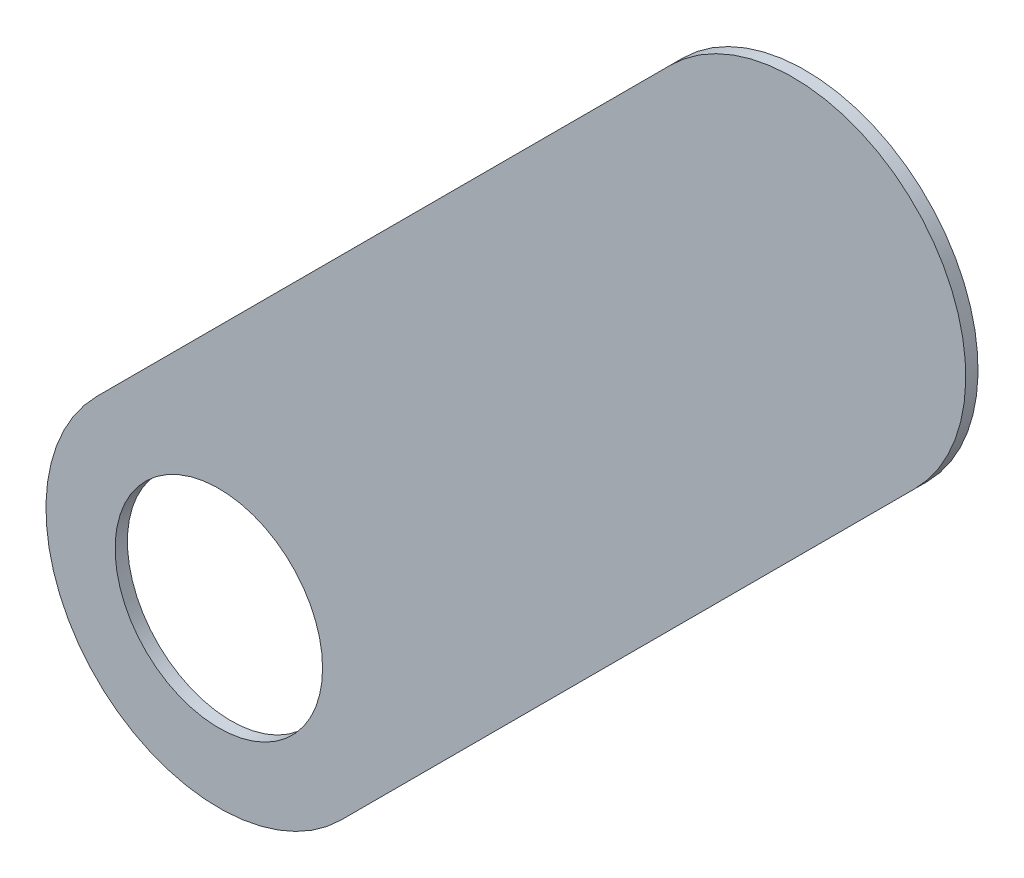
ISO-10303-21;
HEADER;
FILE_DESCRIPTION(('STEP AP214'),'2;1');
FILE_NAME('part.step','',(''),(''),'','','');
FILE_SCHEMA(('AUTOMOTIVE_DESIGN { 1 0 10303 214 1 1 1 1 }'));
ENDSEC;
DATA;
#1=APPLICATION_CONTEXT('core data for automotive mechanical design processes');
#2=APPLICATION_PROTOCOL_DEFINITION('international standard','automotive_design',2000,#1);
#3=PRODUCT_CONTEXT('',#1,'mechanical');
#4=PRODUCT('Part','Part','',(#3));
#5=PRODUCT_RELATED_PRODUCT_CATEGORY('part','',(#4));
#6=PRODUCT_DEFINITION_FORMATION('','',#4);
#7=PRODUCT_DEFINITION_CONTEXT('part definition',#1,'design');
#8=PRODUCT_DEFINITION('design','',#6,#7);
#9=PRODUCT_DEFINITION_SHAPE('','',#8);
#10=(LENGTH_UNIT() NAMED_UNIT(*) SI_UNIT(.MILLI.,.METRE.));
#11=(NAMED_UNIT(*) PLANE_ANGLE_UNIT() SI_UNIT($,.RADIAN.));
#12=(NAMED_UNIT(*) SI_UNIT($,.STERADIAN.) SOLID_ANGLE_UNIT());
#13=UNCERTAINTY_MEASURE_WITH_UNIT(LENGTH_MEASURE(1.E-05),#10,'distance_accuracy_value','');
#14=(GEOMETRIC_REPRESENTATION_CONTEXT(3) GLOBAL_UNCERTAINTY_ASSIGNED_CONTEXT((#13)) GLOBAL_UNIT_ASSIGNED_CONTEXT((#10,
#11,#12)) REPRESENTATION_CONTEXT('',''));
#15=CARTESIAN_POINT('',(0.,0.,0.));
#16=DIRECTION('',(0.,0.,1.));
#17=DIRECTION('',(1.,0.,0.));
#18=AXIS2_PLACEMENT_3D('',#15,#16,#17);
#19=CARTESIAN_POINT('',(57.79356996,78.14646804,0.));
#20=DIRECTION('',(-0.707106781186541,0.707106781186554,0.));
#21=DIRECTION('',(0.707106781186554,0.707106781186541,0.));
#22=AXIS2_PLACEMENT_3D('',#19,#20,#21);
#23=PLANE('',#22);
#24=DIRECTION('',(0.707106781186554,0.707106781186541,0.));
#25=VECTOR('',#24,1.);
#26=CARTESIAN_POINT('',(57.79356996,78.14646804,0.03556));
#27=LINE('',#26,#25);
#28=CARTESIAN_POINT('',(57.79356996,78.14646804,0.03556));
#29=VERTEX_POINT('',#28);
#30=CARTESIAN_POINT('',(59.45356156,79.80645964,0.03556));
#31=VERTEX_POINT('',#30);
#32=EDGE_CURVE('E11',#29,#31,#27,.T.);
#33=ORIENTED_EDGE('',*,*,#32,.F.);
#34=DIRECTION('',(0.,0.,1.));
#35=VECTOR('',#34,1.);
#36=CARTESIAN_POINT('',(57.79356996,78.14646804,0.));
#37=LINE('',#36,#35);
#38=CARTESIAN_POINT('',(57.79356996,78.14646804,0.));
#39=VERTEX_POINT('',#38);
#40=EDGE_CURVE('E24',#39,#29,#37,.T.);
#41=ORIENTED_EDGE('',*,*,#40,.F.);
#42=DIRECTION('',(0.707106781186554,0.707106781186541,0.));
#43=VECTOR('',#42,1.);
#44=CARTESIAN_POINT('',(57.79356996,78.14646804,0.));
#45=LINE('',#44,#43);
#46=CARTESIAN_POINT('',(59.45356156,79.80645964,0.));
#47=VERTEX_POINT('',#46);
#48=EDGE_CURVE('E96',#39,#47,#45,.T.);
#49=ORIENTED_EDGE('',*,*,#48,.T.);
#50=DIRECTION('',(0.,0.,1.));
#51=VECTOR('',#50,1.);
#52=CARTESIAN_POINT('',(59.45356156,79.80645964,0.));
#53=LINE('',#52,#51);
#54=EDGE_CURVE('E37',#47,#31,#53,.T.);
#55=ORIENTED_EDGE('',*,*,#54,.T.);
#56=EDGE_LOOP('',(#33,#41,#49,#55));
#57=FACE_BOUND('',#56,.T.);
#58=ADVANCED_FACE('F17',(#57),#23,.F.);
#59=CARTESIAN_POINT('',(57.4400172,78.5000208,0.));
#60=DIRECTION('',(0.,0.,-1.));
#61=DIRECTION('',(-0.707106781186548,0.707106781186548,0.));
#62=AXIS2_PLACEMENT_3D('',#59,#60,#61);
#63=CYLINDRICAL_SURFACE('',#62,0.499999108206438);
#64=CARTESIAN_POINT('',(57.4400172,78.5000208,0.03556));
#65=DIRECTION('',(0.,0.,1.));
#66=DIRECTION('',(-0.707106781186548,0.707106781186548,0.));
#67=AXIS2_PLACEMENT_3D('',#64,#65,#66);
#68=CIRCLE('',#67,0.499999108206438);
#69=CARTESIAN_POINT('',(57.08646444,78.85357356,0.03556));
#70=VERTEX_POINT('',#69);
#71=EDGE_CURVE('E92',#70,#29,#68,.T.);
#72=ORIENTED_EDGE('',*,*,#71,.F.);
#73=DIRECTION('',(0.,0.,1.));
#74=VECTOR('',#73,1.);
#75=CARTESIAN_POINT('',(57.08646444,78.85357356,0.));
#76=LINE('',#75,#74);
#77=CARTESIAN_POINT('',(57.08646444,78.85357356,0.));
#78=VERTEX_POINT('',#77);
#79=EDGE_CURVE('E90',#78,#70,#76,.T.);
#80=ORIENTED_EDGE('',*,*,#79,.F.);
#81=CARTESIAN_POINT('',(57.4400172,78.5000208,0.));
#82=DIRECTION('',(0.,0.,1.));
#83=DIRECTION('',(-0.707106781186548,0.707106781186548,0.));
#84=AXIS2_PLACEMENT_3D('',#81,#82,#83);
#85=CIRCLE('',#84,0.499999108206438);
#86=EDGE_CURVE('E88',#78,#39,#85,.T.);
#87=ORIENTED_EDGE('',*,*,#86,.T.);
#88=ORIENTED_EDGE('',*,*,#40,.T.);
#89=EDGE_LOOP('',(#72,#80,#87,#88));
#90=FACE_BOUND('',#89,.T.);
#91=ADVANCED_FACE('F111',(#90),#63,.T.);
#92=CARTESIAN_POINT('',(59.1000088,80.1600124,0.));
#93=DIRECTION('',(0.,0.,-1.));
#94=DIRECTION('',(0.70710678118654,-0.707106781186555,0.));
#95=AXIS2_PLACEMENT_3D('',#92,#93,#94);
#96=CYLINDRICAL_SURFACE('',#95,0.499999108206446);
#97=CARTESIAN_POINT('',(59.1000088,80.1600124,0.03556));
#98=DIRECTION('',(0.,0.,1.));
#99=DIRECTION('',(0.70710678118654,-0.707106781186555,0.));
#100=AXIS2_PLACEMENT_3D('',#97,#98,#99);
#101=CIRCLE('',#100,0.499999108206446);
#102=CARTESIAN_POINT('',(58.74645604,80.51356516,0.03556));
#103=VERTEX_POINT('',#102);
#104=EDGE_CURVE('E85',#31,#103,#101,.T.);
#105=ORIENTED_EDGE('',*,*,#104,.F.);
#106=ORIENTED_EDGE('',*,*,#54,.F.);
#107=CARTESIAN_POINT('',(59.1000088,80.1600124,0.));
#108=DIRECTION('',(0.,0.,1.));
#109=DIRECTION('',(0.70710678118654,-0.707106781186555,0.));
#110=AXIS2_PLACEMENT_3D('',#107,#108,#109);
#111=CIRCLE('',#110,0.499999108206446);
#112=CARTESIAN_POINT('',(58.74645604,80.51356516,0.));
#113=VERTEX_POINT('',#112);
#114=EDGE_CURVE('E82',#47,#113,#111,.T.);
#115=ORIENTED_EDGE('',*,*,#114,.T.);
#116=DIRECTION('',(0.,0.,1.));
#117=VECTOR('',#116,1.);
#118=CARTESIAN_POINT('',(58.74645604,80.51356516,0.));
#119=LINE('',#118,#117);
#120=EDGE_CURVE('E80',#113,#103,#119,.T.);
#121=ORIENTED_EDGE('',*,*,#120,.T.);
#122=EDGE_LOOP('',(#105,#106,#115,#121));
#123=FACE_BOUND('',#122,.T.);
#124=ADVANCED_FACE('F104',(#123),#96,.T.);
#125=CARTESIAN_POINT('',(58.74645604,80.51356516,0.));
#126=DIRECTION('',(0.707106781186548,-0.707106781186548,0.));
#127=DIRECTION('',(-0.707106781186548,-0.707106781186548,0.));
#128=AXIS2_PLACEMENT_3D('',#125,#126,#127);
#129=PLANE('',#128);
#130=DIRECTION('',(-0.707106781186548,-0.707106781186548,0.));
#131=VECTOR('',#130,1.);
#132=CARTESIAN_POINT('',(58.74645604,80.51356516,0.03556));
#133=LINE('',#132,#131);
#134=EDGE_CURVE('E77',#103,#70,#133,.T.);
#135=ORIENTED_EDGE('',*,*,#134,.F.);
#136=ORIENTED_EDGE('',*,*,#120,.F.);
#137=DIRECTION('',(-0.707106781186548,-0.707106781186548,0.));
#138=VECTOR('',#137,1.);
#139=CARTESIAN_POINT('',(58.74645604,80.51356516,0.));
#140=LINE('',#139,#138);
#141=EDGE_CURVE('E68',#113,#78,#140,.T.);
#142=ORIENTED_EDGE('',*,*,#141,.T.);
#143=ORIENTED_EDGE('',*,*,#79,.T.);
#144=EDGE_LOOP('',(#135,#136,#142,#143));
#145=FACE_BOUND('',#144,.T.);
#146=ADVANCED_FACE('F110',(#145),#129,.F.);
#147=CARTESIAN_POINT('',(57.4400172,78.5000208,0.));
#148=DIRECTION('',(0.,0.,-1.));
#149=DIRECTION('',(1.,0.,0.));
#150=AXIS2_PLACEMENT_3D('',#147,#148,#149);
#151=CYLINDRICAL_SURFACE('',#150,0.2999994);
#152=DIRECTION('',(0.,0.,1.));
#153=VECTOR('',#152,1.);
#154=CARTESIAN_POINT('',(57.7400166,78.5000208,0.));
#155=LINE('',#154,#153);
#156=CARTESIAN_POINT('',(57.7400166,78.5000208,0.));
#157=VERTEX_POINT('',#156);
#158=CARTESIAN_POINT('',(57.7400166,78.5000208,0.03556));
#159=VERTEX_POINT('',#158);
#160=EDGE_CURVE('E62',#157,#159,#155,.T.);
#161=ORIENTED_EDGE('',*,*,#160,.T.);
#162=CARTESIAN_POINT('',(57.4400172,78.5000208,0.03556));
#163=DIRECTION('',(0.,0.,1.));
#164=DIRECTION('',(1.,0.,0.));
#165=AXIS2_PLACEMENT_3D('',#162,#163,#164);
#166=CIRCLE('',#165,0.2999994);
#167=EDGE_CURVE('E67',#159,#159,#166,.T.);
#168=ORIENTED_EDGE('',*,*,#167,.T.);
#169=ORIENTED_EDGE('',*,*,#160,.F.);
#170=CARTESIAN_POINT('',(57.4400172,78.5000208,0.));
#171=DIRECTION('',(0.,0.,1.));
#172=DIRECTION('',(1.,0.,0.));
#173=AXIS2_PLACEMENT_3D('',#170,#171,#172);
#174=CIRCLE('',#173,0.2999994);
#175=EDGE_CURVE('E65',#157,#157,#174,.T.);
#176=ORIENTED_EDGE('',*,*,#175,.F.);
#177=EDGE_LOOP('',(#161,#168,#169,#176));
#178=FACE_BOUND('',#177,.T.);
#179=ADVANCED_FACE('F64',(#178),#151,.F.);
#180=CARTESIAN_POINT('',(57.79356996,78.14646804,0.));
#181=DIRECTION('',(0.,0.,-1.));
#182=DIRECTION('',(-1.,0.,0.));
#183=AXIS2_PLACEMENT_3D('',#180,#181,#182);
#184=PLANE('',#183);
#185=ORIENTED_EDGE('',*,*,#48,.F.);
#186=ORIENTED_EDGE('',*,*,#86,.F.);
#187=ORIENTED_EDGE('',*,*,#141,.F.);
#188=ORIENTED_EDGE('',*,*,#114,.F.);
#189=EDGE_LOOP('',(#185,#186,#187,#188));
#190=FACE_BOUND('',#189,.T.);
#191=ORIENTED_EDGE('',*,*,#175,.T.);
#192=EDGE_LOOP('',(#191));
#193=FACE_BOUND('',#192,.T.);
#194=ADVANCED_FACE('F71',(#190,#193),#184,.T.);
#195=CARTESIAN_POINT('',(57.79356996,78.14646804,0.03556));
#196=DIRECTION('',(0.,0.,-1.));
#197=DIRECTION('',(-1.,0.,0.));
#198=AXIS2_PLACEMENT_3D('',#195,#196,#197);
#199=PLANE('',#198);
#200=ORIENTED_EDGE('',*,*,#134,.T.);
#201=ORIENTED_EDGE('',*,*,#71,.T.);
#202=ORIENTED_EDGE('',*,*,#32,.T.);
#203=ORIENTED_EDGE('',*,*,#104,.T.);
#204=EDGE_LOOP('',(#200,#201,#202,#203));
#205=FACE_BOUND('',#204,.T.);
#206=ORIENTED_EDGE('',*,*,#167,.F.);
#207=EDGE_LOOP('',(#206));
#208=FACE_BOUND('',#207,.T.);
#209=ADVANCED_FACE('F107',(#205,#208),#199,.F.);
#210=CLOSED_SHELL('',(#58,#91,#124,#146,#179,#194,#209));
#211=MANIFOLD_SOLID_BREP('B1',#210);
#212=ADVANCED_BREP_SHAPE_REPRESENTATION('',(#18,#211),#14);
#213=SHAPE_DEFINITION_REPRESENTATION(#9,#212);
ENDSEC;
END-ISO-10303-21;
